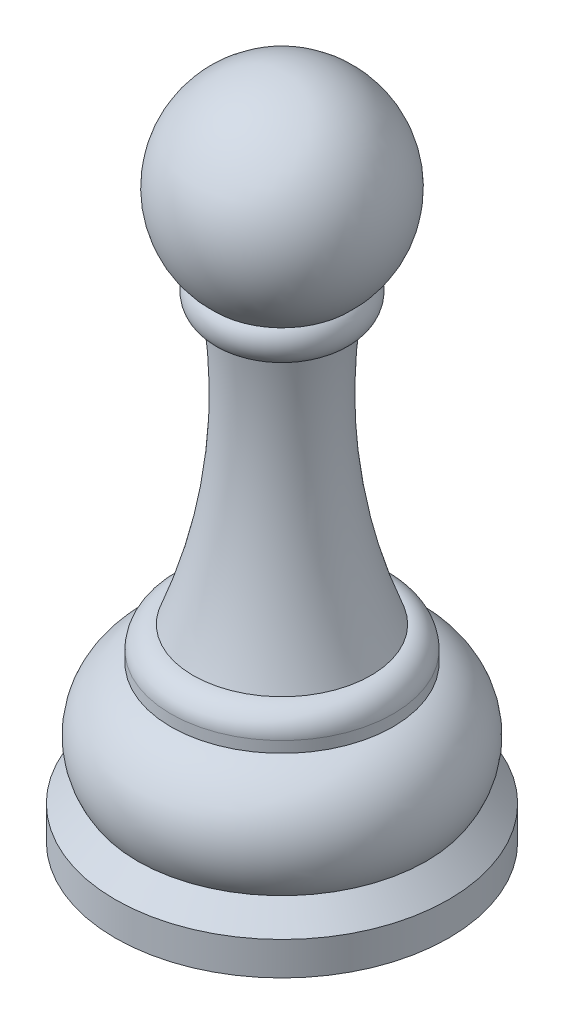
ISO-10303-21;
HEADER;
FILE_DESCRIPTION(('STEP AP214'),'2;1');
FILE_NAME('part.step','',(''),(''),'','','');
FILE_SCHEMA(('AUTOMOTIVE_DESIGN { 1 0 10303 214 1 1 1 1 }'));
ENDSEC;
DATA;
#1=APPLICATION_CONTEXT('core data for automotive mechanical design processes');
#2=APPLICATION_PROTOCOL_DEFINITION('international standard','automotive_design',2000,#1);
#3=PRODUCT_CONTEXT('',#1,'mechanical');
#4=PRODUCT('Part','Part','',(#3));
#5=PRODUCT_RELATED_PRODUCT_CATEGORY('part','',(#4));
#6=PRODUCT_DEFINITION_FORMATION('','',#4);
#7=PRODUCT_DEFINITION_CONTEXT('part definition',#1,'design');
#8=PRODUCT_DEFINITION('design','',#6,#7);
#9=PRODUCT_DEFINITION_SHAPE('','',#8);
#10=(LENGTH_UNIT() NAMED_UNIT(*) SI_UNIT(.MILLI.,.METRE.));
#11=(NAMED_UNIT(*) PLANE_ANGLE_UNIT() SI_UNIT($,.RADIAN.));
#12=(NAMED_UNIT(*) SI_UNIT($,.STERADIAN.) SOLID_ANGLE_UNIT());
#13=UNCERTAINTY_MEASURE_WITH_UNIT(LENGTH_MEASURE(1.E-05),#10,'distance_accuracy_value','');
#14=(GEOMETRIC_REPRESENTATION_CONTEXT(3) GLOBAL_UNCERTAINTY_ASSIGNED_CONTEXT((#13)) GLOBAL_UNIT_ASSIGNED_CONTEXT((#10,
#11,#12)) REPRESENTATION_CONTEXT('',''));
#15=CARTESIAN_POINT('',(0.,0.,0.));
#16=DIRECTION('',(0.,0.,1.));
#17=DIRECTION('',(1.,0.,0.));
#18=AXIS2_PLACEMENT_3D('',#15,#16,#17);
#19=CARTESIAN_POINT('',(0.,51.0182039324994,0.));
#20=DIRECTION('',(0.,1.,0.));
#21=DIRECTION('',(-1.,0.,0.));
#22=AXIS2_PLACEMENT_3D('',#19,#20,#21);
#23=SPHERICAL_SURFACE('',#22,9.);
#24=CARTESIAN_POINT('',(0.,44.31,0.));
#25=DIRECTION('',(0.,1.,0.));
#26=DIRECTION('',(0.,0.,1.));
#27=AXIS2_PLACEMENT_3D('',#24,#25,#26);
#28=CIRCLE('',#27,5.99999999999999);
#29=CARTESIAN_POINT('',(0.,44.31,5.99999999999999));
#30=VERTEX_POINT('',#29);
#31=EDGE_CURVE('E10',#30,#30,#28,.T.);
#32=ORIENTED_EDGE('',*,*,#31,.T.);
#33=EDGE_LOOP('',(#32));
#34=FACE_BOUND('',#33,.T.);
#35=ADVANCED_FACE('F32',(#34),#23,.T.);
#36=CARTESIAN_POINT('',(0.,42.9871243444677,0.));
#37=DIRECTION('',(0.,1.,0.));
#38=DIRECTION('',(0.,0.,1.));
#39=AXIS2_PLACEMENT_3D('',#36,#37,#38);
#40=TOROIDAL_SURFACE('',#39,4.49999999999999,2.);
#41=CARTESIAN_POINT('',(0.,41.05,0.));
#42=DIRECTION('',(0.,1.,0.));
#43=DIRECTION('',(0.,0.,1.));
#44=AXIS2_PLACEMENT_3D('',#41,#42,#43);
#45=CIRCLE('',#44,4.99754323839297);
#46=CARTESIAN_POINT('',(0.,41.05,4.99754323839297));
#47=VERTEX_POINT('',#46);
#48=EDGE_CURVE('E38',#47,#47,#45,.T.);
#49=ORIENTED_EDGE('',*,*,#48,.T.);
#50=EDGE_LOOP('',(#49));
#51=FACE_BOUND('',#50,.T.);
#52=ORIENTED_EDGE('',*,*,#31,.F.);
#53=EDGE_LOOP('',(#52));
#54=FACE_BOUND('',#53,.T.);
#55=ADVANCED_FACE('F76',(#51,#54),#40,.T.);
#56=CARTESIAN_POINT('',(0.,35.0115220574194,0.));
#57=DIRECTION('',(0.,1.,0.));
#58=DIRECTION('',(0.,0.,1.));
#59=AXIS2_PLACEMENT_3D('',#56,#57,#58);
#60=TOROIDAL_SURFACE('',#59,54.6315717283007,50.);
#61=CARTESIAN_POINT('',(0.,16.97,0.));
#62=DIRECTION('',(0.,1.,0.));
#63=DIRECTION('',(0.,0.,1.));
#64=AXIS2_PLACEMENT_3D('',#61,#62,#63);
#65=CIRCLE('',#64,7.99999999999999);
#66=CARTESIAN_POINT('',(0.,16.97,7.99999999999999));
#67=VERTEX_POINT('',#66);
#68=EDGE_CURVE('E42',#67,#67,#65,.T.);
#69=ORIENTED_EDGE('',*,*,#68,.T.);
#70=EDGE_LOOP('',(#69));
#71=FACE_BOUND('',#70,.T.);
#72=ORIENTED_EDGE('',*,*,#48,.F.);
#73=EDGE_LOOP('',(#72));
#74=FACE_BOUND('',#73,.T.);
#75=ADVANCED_FACE('F80',(#71,#74),#60,.F.);
#76=CARTESIAN_POINT('',(0.,14.97,0.));
#77=DIRECTION('',(0.,1.,0.));
#78=DIRECTION('',(0.,0.,1.));
#79=AXIS2_PLACEMENT_3D('',#76,#77,#78);
#80=TOROIDAL_SURFACE('',#79,7.99999999999999,2.);
#81=CARTESIAN_POINT('',(0.,14.97,0.));
#82=DIRECTION('',(0.,1.,0.));
#83=DIRECTION('',(0.,0.,1.));
#84=AXIS2_PLACEMENT_3D('',#81,#82,#83);
#85=CIRCLE('',#84,9.99999999999999);
#86=CARTESIAN_POINT('',(0.,14.97,9.99999999999999));
#87=VERTEX_POINT('',#86);
#88=EDGE_CURVE('E46',#87,#87,#85,.T.);
#89=ORIENTED_EDGE('',*,*,#88,.T.);
#90=EDGE_LOOP('',(#89));
#91=FACE_BOUND('',#90,.T.);
#92=ORIENTED_EDGE('',*,*,#68,.F.);
#93=EDGE_LOOP('',(#92));
#94=FACE_BOUND('',#93,.T.);
#95=ADVANCED_FACE('F84',(#91,#94),#80,.T.);
#96=CARTESIAN_POINT('',(0.,102.341178824441,0.));
#97=DIRECTION('',(0.,1.,0.));
#98=DIRECTION('',(0.,0.,1.));
#99=AXIS2_PLACEMENT_3D('',#96,#97,#98);
#100=CYLINDRICAL_SURFACE('',#99,9.99999999999999);
#101=CARTESIAN_POINT('',(0.,13.97,0.));
#102=DIRECTION('',(0.,1.,0.));
#103=DIRECTION('',(0.,0.,1.));
#104=AXIS2_PLACEMENT_3D('',#101,#102,#103);
#105=CIRCLE('',#104,9.99999999999999);
#106=CARTESIAN_POINT('',(0.,13.97,9.99999999999999));
#107=VERTEX_POINT('',#106);
#108=EDGE_CURVE('E51',#107,#107,#105,.T.);
#109=ORIENTED_EDGE('',*,*,#108,.T.);
#110=EDGE_LOOP('',(#109));
#111=FACE_BOUND('',#110,.T.);
#112=ORIENTED_EDGE('',*,*,#88,.F.);
#113=EDGE_LOOP('',(#112));
#114=FACE_BOUND('',#113,.T.);
#115=ADVANCED_FACE('F91',(#111,#114),#100,.T.);
#116=CARTESIAN_POINT('',(0.,8.31380661428568,0.));
#117=DIRECTION('',(0.,1.,0.));
#118=DIRECTION('',(0.,0.,1.));
#119=AXIS2_PLACEMENT_3D('',#116,#117,#118);
#120=TOROIDAL_SURFACE('',#119,7.99813177671416,6.);
#121=CARTESIAN_POINT('',(0.,5.,0.));
#122=DIRECTION('',(0.,1.,0.));
#123=DIRECTION('',(0.,0.,1.));
#124=AXIS2_PLACEMENT_3D('',#121,#122,#123);
#125=CIRCLE('',#124,13.);
#126=CARTESIAN_POINT('',(0.,5.,13.));
#127=VERTEX_POINT('',#126);
#128=EDGE_CURVE('E54',#127,#127,#125,.T.);
#129=ORIENTED_EDGE('',*,*,#128,.T.);
#130=EDGE_LOOP('',(#129));
#131=FACE_BOUND('',#130,.T.);
#132=ORIENTED_EDGE('',*,*,#108,.F.);
#133=EDGE_LOOP('',(#132));
#134=FACE_BOUND('',#133,.T.);
#135=ADVANCED_FACE('F95',(#131,#134),#120,.T.);
#136=CARTESIAN_POINT('',(0.,5.,0.));
#137=DIRECTION('',(0.,-1.,0.));
#138=DIRECTION('',(0.,0.,-1.));
#139=AXIS2_PLACEMENT_3D('',#136,#137,#138);
#140=CONICAL_SURFACE('',#139,13.,0.785398163397451);
#141=CARTESIAN_POINT('',(0.,3.,0.));
#142=DIRECTION('',(0.,1.,0.));
#143=DIRECTION('',(0.,0.,1.));
#144=AXIS2_PLACEMENT_3D('',#141,#142,#143);
#145=CIRCLE('',#144,15.);
#146=CARTESIAN_POINT('',(0.,3.,15.));
#147=VERTEX_POINT('',#146);
#148=EDGE_CURVE('E57',#147,#147,#145,.T.);
#149=ORIENTED_EDGE('',*,*,#148,.T.);
#150=EDGE_LOOP('',(#149));
#151=FACE_BOUND('',#150,.T.);
#152=ORIENTED_EDGE('',*,*,#128,.F.);
#153=EDGE_LOOP('',(#152));
#154=FACE_BOUND('',#153,.T.);
#155=ADVANCED_FACE('F73',(#151,#154),#140,.T.);
#156=CARTESIAN_POINT('',(0.,102.341178824441,0.));
#157=DIRECTION('',(0.,1.,0.));
#158=DIRECTION('',(0.,0.,1.));
#159=AXIS2_PLACEMENT_3D('',#156,#157,#158);
#160=CYLINDRICAL_SURFACE('',#159,15.);
#161=CARTESIAN_POINT('',(0.,0.,0.));
#162=DIRECTION('',(0.,1.,0.));
#163=DIRECTION('',(0.,0.,1.));
#164=AXIS2_PLACEMENT_3D('',#161,#162,#163);
#165=CIRCLE('',#164,15.);
#166=CARTESIAN_POINT('',(0.,0.,15.));
#167=VERTEX_POINT('',#166);
#168=EDGE_CURVE('E60',#167,#167,#165,.T.);
#169=ORIENTED_EDGE('',*,*,#168,.T.);
#170=EDGE_LOOP('',(#169));
#171=FACE_BOUND('',#170,.T.);
#172=ORIENTED_EDGE('',*,*,#148,.F.);
#173=EDGE_LOOP('',(#172));
#174=FACE_BOUND('',#173,.T.);
#175=ADVANCED_FACE('F64',(#171,#174),#160,.T.);
#176=CARTESIAN_POINT('',(0.,0.,0.));
#177=DIRECTION('',(0.,-1.,0.));
#178=DIRECTION('',(0.,0.,-1.));
#179=AXIS2_PLACEMENT_3D('',#176,#177,#178);
#180=PLANE('',#179);
#181=ORIENTED_EDGE('',*,*,#168,.F.);
#182=EDGE_LOOP('',(#181));
#183=FACE_BOUND('',#182,.T.);
#184=ADVANCED_FACE('F67',(#183),#180,.T.);
#185=CLOSED_SHELL('',(#35,#55,#75,#95,#115,#135,#155,#175,#184));
#186=MANIFOLD_SOLID_BREP('B2',#185);
#187=ADVANCED_BREP_SHAPE_REPRESENTATION('',(#18,#186),#14);
#188=SHAPE_DEFINITION_REPRESENTATION(#9,#187);
ENDSEC;
END-ISO-10303-21;
